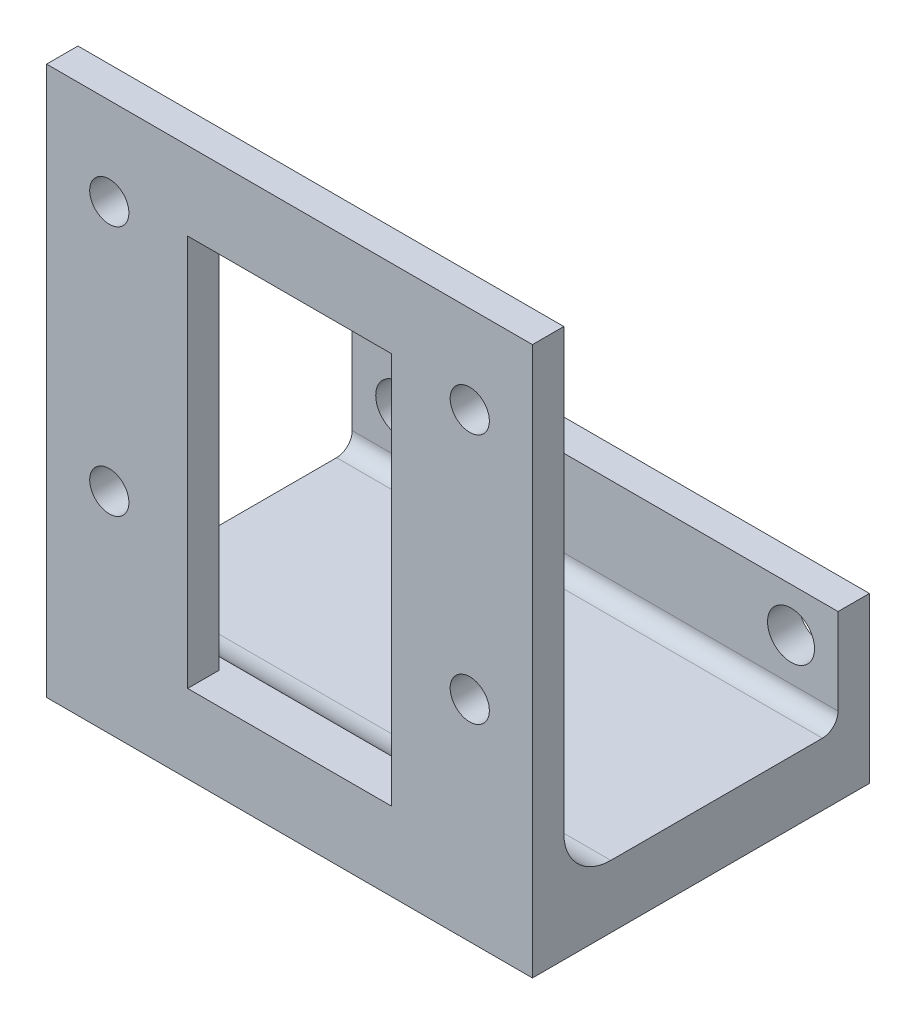
ISO-10303-21;
HEADER;
FILE_DESCRIPTION(('STEP AP214'),'2;1');
FILE_NAME('part.step','',(''),(''),'','','');
FILE_SCHEMA(('AUTOMOTIVE_DESIGN { 1 0 10303 214 1 1 1 1 }'));
ENDSEC;
DATA;
#1=APPLICATION_CONTEXT('core data for automotive mechanical design processes');
#2=APPLICATION_PROTOCOL_DEFINITION('international standard','automotive_design',2000,#1);
#3=PRODUCT_CONTEXT('',#1,'mechanical');
#4=PRODUCT('Part','Part','',(#3));
#5=PRODUCT_RELATED_PRODUCT_CATEGORY('part','',(#4));
#6=PRODUCT_DEFINITION_FORMATION('','',#4);
#7=PRODUCT_DEFINITION_CONTEXT('part definition',#1,'design');
#8=PRODUCT_DEFINITION('design','',#6,#7);
#9=PRODUCT_DEFINITION_SHAPE('','',#8);
#10=(LENGTH_UNIT() NAMED_UNIT(*) SI_UNIT(.MILLI.,.METRE.));
#11=(NAMED_UNIT(*) PLANE_ANGLE_UNIT() SI_UNIT($,.RADIAN.));
#12=(NAMED_UNIT(*) SI_UNIT($,.STERADIAN.) SOLID_ANGLE_UNIT());
#13=UNCERTAINTY_MEASURE_WITH_UNIT(LENGTH_MEASURE(1.E-05),#10,'distance_accuracy_value','');
#14=(GEOMETRIC_REPRESENTATION_CONTEXT(3) GLOBAL_UNCERTAINTY_ASSIGNED_CONTEXT((#13)) GLOBAL_UNIT_ASSIGNED_CONTEXT((#10,
#11,#12)) REPRESENTATION_CONTEXT('',''));
#15=CARTESIAN_POINT('',(0.,0.,0.));
#16=DIRECTION('',(0.,0.,1.));
#17=DIRECTION('',(1.,0.,0.));
#18=AXIS2_PLACEMENT_3D('',#15,#16,#17);
#19=CARTESIAN_POINT('',(0.,0.,25.));
#20=DIRECTION('',(0.,0.,-1.));
#21=DIRECTION('',(-1.,0.,0.));
#22=AXIS2_PLACEMENT_3D('',#19,#20,#21);
#23=PLANE('',#22);
#24=CARTESIAN_POINT('',(4.00000000000002,11.4,25.));
#25=DIRECTION('',(0.,0.,-1.));
#26=DIRECTION('',(-1.,0.,0.));
#27=AXIS2_PLACEMENT_3D('',#24,#25,#26);
#28=CIRCLE('',#27,1.25);
#29=CARTESIAN_POINT('',(2.75000000000001,11.4,25.));
#30=VERTEX_POINT('',#29);
#31=EDGE_CURVE('E323',#30,#30,#28,.T.);
#32=ORIENTED_EDGE('',*,*,#31,.F.);
#33=EDGE_LOOP('',(#32));
#34=FACE_BOUND('',#33,.T.);
#35=CARTESIAN_POINT('',(-19.,11.4,25.));
#36=DIRECTION('',(0.,0.,-1.));
#37=DIRECTION('',(-1.,0.,0.));
#38=AXIS2_PLACEMENT_3D('',#35,#36,#37);
#39=CIRCLE('',#38,1.25);
#40=CARTESIAN_POINT('',(-20.25,11.4,25.));
#41=VERTEX_POINT('',#40);
#42=EDGE_CURVE('E326',#41,#41,#39,.T.);
#43=ORIENTED_EDGE('',*,*,#42,.F.);
#44=EDGE_LOOP('',(#43));
#45=FACE_BOUND('',#44,.T.);
#46=CARTESIAN_POINT('',(-19.,27.4,25.));
#47=DIRECTION('',(0.,0.,-1.));
#48=DIRECTION('',(-1.,0.,0.));
#49=AXIS2_PLACEMENT_3D('',#46,#47,#48);
#50=CIRCLE('',#49,1.25);
#51=CARTESIAN_POINT('',(-20.25,27.4,25.));
#52=VERTEX_POINT('',#51);
#53=EDGE_CURVE('E329',#52,#52,#50,.T.);
#54=ORIENTED_EDGE('',*,*,#53,.F.);
#55=EDGE_LOOP('',(#54));
#56=FACE_BOUND('',#55,.T.);
#57=CARTESIAN_POINT('',(4.00000000000001,27.4,25.));
#58=DIRECTION('',(0.,0.,-1.));
#59=DIRECTION('',(-1.,0.,0.));
#60=AXIS2_PLACEMENT_3D('',#57,#58,#59);
#61=CIRCLE('',#60,1.25);
#62=CARTESIAN_POINT('',(2.75000000000001,27.4,25.));
#63=VERTEX_POINT('',#62);
#64=EDGE_CURVE('E317',#63,#63,#61,.T.);
#65=ORIENTED_EDGE('',*,*,#64,.F.);
#66=EDGE_LOOP('',(#65));
#67=FACE_BOUND('',#66,.T.);
#68=DIRECTION('',(1.,0.,0.));
#69=VECTOR('',#68,1.);
#70=CARTESIAN_POINT('',(0.,28.,25.));
#71=LINE('',#70,#69);
#72=CARTESIAN_POINT('',(-14.,28.,25.));
#73=VERTEX_POINT('',#72);
#74=CARTESIAN_POINT('',(-0.999999999999992,28.,25.));
#75=VERTEX_POINT('',#74);
#76=EDGE_CURVE('E237',#73,#75,#71,.T.);
#77=ORIENTED_EDGE('',*,*,#76,.F.);
#78=DIRECTION('',(0.,1.,0.));
#79=VECTOR('',#78,1.);
#80=CARTESIAN_POINT('',(-14.,0.,25.));
#81=LINE('',#80,#79);
#82=CARTESIAN_POINT('',(-14.,3.,25.));
#83=VERTEX_POINT('',#82);
#84=EDGE_CURVE('E302',#83,#73,#81,.T.);
#85=ORIENTED_EDGE('',*,*,#84,.F.);
#86=DIRECTION('',(-1.,0.,0.));
#87=VECTOR('',#86,1.);
#88=CARTESIAN_POINT('',(0.,3.,25.));
#89=LINE('',#88,#87);
#90=CARTESIAN_POINT('',(-16.,3.,25.));
#91=VERTEX_POINT('',#90);
#92=EDGE_CURVE('E306',#83,#91,#89,.T.);
#93=ORIENTED_EDGE('',*,*,#92,.T.);
#94=DIRECTION('',(0.,1.,0.));
#95=VECTOR('',#94,1.);
#96=CARTESIAN_POINT('',(-16.,0.,25.));
#97=LINE('',#96,#95);
#98=CARTESIAN_POINT('',(-16.,5.,25.));
#99=VERTEX_POINT('',#98);
#100=EDGE_CURVE('E183',#91,#99,#97,.T.);
#101=ORIENTED_EDGE('',*,*,#100,.T.);
#102=DIRECTION('',(-1.,0.,0.));
#103=VECTOR('',#102,1.);
#104=CARTESIAN_POINT('',(0.,5.,25.));
#105=LINE('',#104,#103);
#106=CARTESIAN_POINT('',(-23.,5.,25.));
#107=VERTEX_POINT('',#106);
#108=EDGE_CURVE('E221',#99,#107,#105,.T.);
#109=ORIENTED_EDGE('',*,*,#108,.T.);
#110=DIRECTION('',(0.,-1.,0.));
#111=VECTOR('',#110,1.);
#112=CARTESIAN_POINT('',(-23.,0.,25.));
#113=LINE('',#112,#111);
#114=CARTESIAN_POINT('',(-23.,33.,25.));
#115=VERTEX_POINT('',#114);
#116=EDGE_CURVE('E291',#115,#107,#113,.T.);
#117=ORIENTED_EDGE('',*,*,#116,.F.);
#118=DIRECTION('',(-1.,0.,0.));
#119=VECTOR('',#118,1.);
#120=CARTESIAN_POINT('',(-8.,33.,25.));
#121=LINE('',#120,#119);
#122=CARTESIAN_POINT('',(8.00000000000001,33.,25.));
#123=VERTEX_POINT('',#122);
#124=EDGE_CURVE('E200',#123,#115,#121,.T.);
#125=ORIENTED_EDGE('',*,*,#124,.F.);
#126=DIRECTION('',(0.,1.,0.));
#127=VECTOR('',#126,1.);
#128=CARTESIAN_POINT('',(8.00000000000001,-2.00000000000001,25.));
#129=LINE('',#128,#127);
#130=CARTESIAN_POINT('',(8.00000000000001,5.,25.));
#131=VERTEX_POINT('',#130);
#132=EDGE_CURVE('E198',#131,#123,#129,.T.);
#133=ORIENTED_EDGE('',*,*,#132,.F.);
#134=CARTESIAN_POINT('',(-0.999999999999989,5.,25.));
#135=VERTEX_POINT('',#134);
#136=EDGE_CURVE('E222',#131,#135,#105,.T.);
#137=ORIENTED_EDGE('',*,*,#136,.T.);
#138=DIRECTION('',(0.,1.,0.));
#139=VECTOR('',#138,1.);
#140=CARTESIAN_POINT('',(-0.999999999999988,0.,25.));
#141=LINE('',#140,#139);
#142=EDGE_CURVE('E271',#135,#75,#141,.T.);
#143=ORIENTED_EDGE('',*,*,#142,.T.);
#144=EDGE_LOOP('',(#77,#85,#93,#101,#109,#117,#125,#133,#137,#143));
#145=FACE_BOUND('',#144,.T.);
#146=ADVANCED_FACE('F60',(#34,#45,#56,#67,#145),#23,.T.);
#147=CARTESIAN_POINT('',(0.,5.,22.));
#148=DIRECTION('',(-1.,0.,0.));
#149=DIRECTION('',(0.,-1.,0.));
#150=AXIS2_PLACEMENT_3D('',#147,#148,#149);
#151=CYLINDRICAL_SURFACE('',#150,3.);
#152=DIRECTION('',(-1.,0.,0.));
#153=VECTOR('',#152,1.);
#154=CARTESIAN_POINT('',(8.00000000000001,2.,22.));
#155=LINE('',#154,#153);
#156=CARTESIAN_POINT('',(-23.,2.,22.));
#157=VERTEX_POINT('',#156);
#158=CARTESIAN_POINT('',(8.00000000000001,2.,22.));
#159=VERTEX_POINT('',#158);
#160=EDGE_CURVE('E225',#157,#159,#155,.F.);
#161=ORIENTED_EDGE('',*,*,#160,.F.);
#162=CARTESIAN_POINT('',(-23.,4.99999999999999,22.));
#163=DIRECTION('',(1.,0.,0.));
#164=DIRECTION('',(0.,1.,0.));
#165=AXIS2_PLACEMENT_3D('',#162,#163,#164);
#166=CIRCLE('',#165,3.);
#167=EDGE_CURVE('E293',#157,#107,#166,.F.);
#168=ORIENTED_EDGE('',*,*,#167,.T.);
#169=ORIENTED_EDGE('',*,*,#108,.F.);
#170=CARTESIAN_POINT('',(-16.,5.,22.));
#171=DIRECTION('',(-1.,0.,0.));
#172=DIRECTION('',(0.,-1.,0.));
#173=AXIS2_PLACEMENT_3D('',#170,#171,#172);
#174=CIRCLE('',#173,3.);
#175=CARTESIAN_POINT('',(-16.,3.,24.2360679774998));
#176=VERTEX_POINT('',#175);
#177=EDGE_CURVE('E229',#99,#176,#174,.F.);
#178=ORIENTED_EDGE('',*,*,#177,.T.);
#179=DIRECTION('',(-1.,0.,0.));
#180=VECTOR('',#179,1.);
#181=CARTESIAN_POINT('',(0.,3.,24.2360679774998));
#182=LINE('',#181,#180);
#183=CARTESIAN_POINT('',(-0.999999999999988,3.,24.2360679774998));
#184=VERTEX_POINT('',#183);
#185=EDGE_CURVE('E232',#184,#176,#182,.T.);
#186=ORIENTED_EDGE('',*,*,#185,.F.);
#187=CARTESIAN_POINT('',(-0.999999999999989,5.,22.));
#188=DIRECTION('',(-1.,0.,0.));
#189=DIRECTION('',(0.,-1.,0.));
#190=AXIS2_PLACEMENT_3D('',#187,#188,#189);
#191=CIRCLE('',#190,3.);
#192=EDGE_CURVE('E235',#135,#184,#191,.F.);
#193=ORIENTED_EDGE('',*,*,#192,.F.);
#194=ORIENTED_EDGE('',*,*,#136,.F.);
#195=CARTESIAN_POINT('',(8.00000000000001,5.,22.));
#196=DIRECTION('',(-1.,0.,0.));
#197=DIRECTION('',(0.,-1.,0.));
#198=AXIS2_PLACEMENT_3D('',#195,#196,#197);
#199=CIRCLE('',#198,3.);
#200=EDGE_CURVE('E227',#159,#131,#199,.T.);
#201=ORIENTED_EDGE('',*,*,#200,.F.);
#202=EDGE_LOOP('',(#161,#168,#169,#178,#186,#193,#194,#201));
#203=FACE_BOUND('',#202,.T.);
#204=ADVANCED_FACE('F373',(#203),#151,.F.);
#205=CARTESIAN_POINT('',(8.00000000000001,2.,25.));
#206=DIRECTION('',(0.,-1.,0.));
#207=DIRECTION('',(1.,0.,0.));
#208=AXIS2_PLACEMENT_3D('',#205,#206,#207);
#209=PLANE('',#208);
#210=DIRECTION('',(0.,0.,-1.));
#211=VECTOR('',#210,1.);
#212=CARTESIAN_POINT('',(8.00000000000001,2.,25.));
#213=LINE('',#212,#211);
#214=CARTESIAN_POINT('',(8.00000000000001,2.,8.5));
#215=VERTEX_POINT('',#214);
#216=EDGE_CURVE('E217',#159,#215,#213,.T.);
#217=ORIENTED_EDGE('',*,*,#216,.T.);
#218=DIRECTION('',(1.,0.,0.));
#219=VECTOR('',#218,1.);
#220=CARTESIAN_POINT('',(-23.,2.,8.5));
#221=LINE('',#220,#219);
#222=CARTESIAN_POINT('',(-23.,2.,8.5));
#223=VERTEX_POINT('',#222);
#224=EDGE_CURVE('E81',#215,#223,#221,.F.);
#225=ORIENTED_EDGE('',*,*,#224,.T.);
#226=DIRECTION('',(0.,0.,1.));
#227=VECTOR('',#226,1.);
#228=CARTESIAN_POINT('',(-23.,2.,25.));
#229=LINE('',#228,#227);
#230=EDGE_CURVE('E296',#223,#157,#229,.T.);
#231=ORIENTED_EDGE('',*,*,#230,.T.);
#232=ORIENTED_EDGE('',*,*,#160,.T.);
#233=EDGE_LOOP('',(#217,#225,#231,#232));
#234=FACE_BOUND('',#233,.T.);
#235=ADVANCED_FACE('F395',(#234),#209,.F.);
#236=CARTESIAN_POINT('',(8.00000000000001,-2.00000000000001,25.));
#237=DIRECTION('',(0.,1.,0.));
#238=DIRECTION('',(0.,0.,1.));
#239=AXIS2_PLACEMENT_3D('',#236,#237,#238);
#240=PLANE('',#239);
#241=DIRECTION('',(1.,0.,0.));
#242=VECTOR('',#241,1.);
#243=CARTESIAN_POINT('',(-7.99999999999999,-2.00000000000001,27.));
#244=LINE('',#243,#242);
#245=CARTESIAN_POINT('',(-23.,-2.00000000000001,27.));
#246=VERTEX_POINT('',#245);
#247=CARTESIAN_POINT('',(8.00000000000001,-2.00000000000001,27.));
#248=VERTEX_POINT('',#247);
#249=EDGE_CURVE('E191',#246,#248,#244,.T.);
#250=ORIENTED_EDGE('',*,*,#249,.F.);
#251=DIRECTION('',(0.,0.,-1.));
#252=VECTOR('',#251,1.);
#253=CARTESIAN_POINT('',(-23.,-2.00000000000001,32.5));
#254=LINE('',#253,#252);
#255=CARTESIAN_POINT('',(-23.,-2.00000000000001,5.5));
#256=VERTEX_POINT('',#255);
#257=EDGE_CURVE('E174',#246,#256,#254,.T.);
#258=ORIENTED_EDGE('',*,*,#257,.T.);
#259=DIRECTION('',(1.,0.,0.));
#260=VECTOR('',#259,1.);
#261=CARTESIAN_POINT('',(8.00000000000001,-2.00000000000001,5.5));
#262=LINE('',#261,#260);
#263=CARTESIAN_POINT('',(8.00000000000001,-2.00000000000001,5.5));
#264=VERTEX_POINT('',#263);
#265=EDGE_CURVE('E189',#256,#264,#262,.T.);
#266=ORIENTED_EDGE('',*,*,#265,.T.);
#267=DIRECTION('',(0.,0.,-1.));
#268=VECTOR('',#267,1.);
#269=CARTESIAN_POINT('',(8.00000000000001,-2.00000000000001,25.));
#270=LINE('',#269,#268);
#271=EDGE_CURVE('E219',#248,#264,#270,.T.);
#272=ORIENTED_EDGE('',*,*,#271,.F.);
#273=EDGE_LOOP('',(#250,#258,#266,#272));
#274=FACE_BOUND('',#273,.T.);
#275=ADVANCED_FACE('F187',(#274),#240,.F.);
#276=CARTESIAN_POINT('',(8.00000000000001,2.,25.));
#277=DIRECTION('',(-1.,0.,0.));
#278=DIRECTION('',(0.,-1.,0.));
#279=AXIS2_PLACEMENT_3D('',#276,#277,#278);
#280=PLANE('',#279);
#281=DIRECTION('',(0.,1.,0.));
#282=VECTOR('',#281,1.);
#283=CARTESIAN_POINT('',(8.00000000000001,-8.,5.5));
#284=LINE('',#283,#282);
#285=CARTESIAN_POINT('',(8.00000000000001,8.5,5.5));
#286=VERTEX_POINT('',#285);
#287=EDGE_CURVE('E196',#264,#286,#284,.T.);
#288=ORIENTED_EDGE('',*,*,#287,.T.);
#289=DIRECTION('',(0.,0.,-1.));
#290=VECTOR('',#289,1.);
#291=CARTESIAN_POINT('',(8.00000000000001,8.5,15.5));
#292=LINE('',#291,#290);
#293=CARTESIAN_POINT('',(8.00000000000001,8.5,7.5));
#294=VERTEX_POINT('',#293);
#295=EDGE_CURVE('E258',#294,#286,#292,.T.);
#296=ORIENTED_EDGE('',*,*,#295,.F.);
#297=DIRECTION('',(0.,-1.,0.));
#298=VECTOR('',#297,1.);
#299=CARTESIAN_POINT('',(8.00000000000001,10.,7.5));
#300=LINE('',#299,#298);
#301=CARTESIAN_POINT('',(8.00000000000001,3.,7.5));
#302=VERTEX_POINT('',#301);
#303=EDGE_CURVE('E202',#294,#302,#300,.T.);
#304=ORIENTED_EDGE('',*,*,#303,.T.);
#305=CARTESIAN_POINT('',(8.00000000000001,3.,8.5));
#306=DIRECTION('',(-1.,0.,0.));
#307=DIRECTION('',(0.,-1.,0.));
#308=AXIS2_PLACEMENT_3D('',#305,#306,#307);
#309=CIRCLE('',#308,1.);
#310=EDGE_CURVE('E68',#302,#215,#309,.T.);
#311=ORIENTED_EDGE('',*,*,#310,.T.);
#312=ORIENTED_EDGE('',*,*,#216,.F.);
#313=ORIENTED_EDGE('',*,*,#200,.T.);
#314=ORIENTED_EDGE('',*,*,#132,.T.);
#315=DIRECTION('',(0.,0.,-1.));
#316=VECTOR('',#315,1.);
#317=CARTESIAN_POINT('',(8.00000000000001,33.,27.));
#318=LINE('',#317,#316);
#319=CARTESIAN_POINT('',(8.00000000000001,33.,27.));
#320=VERTEX_POINT('',#319);
#321=EDGE_CURVE('E211',#320,#123,#318,.T.);
#322=ORIENTED_EDGE('',*,*,#321,.F.);
#323=DIRECTION('',(0.,1.,0.));
#324=VECTOR('',#323,1.);
#325=CARTESIAN_POINT('',(8.00000000000001,-2.00000000000001,27.));
#326=LINE('',#325,#324);
#327=EDGE_CURVE('E207',#248,#320,#326,.T.);
#328=ORIENTED_EDGE('',*,*,#327,.F.);
#329=ORIENTED_EDGE('',*,*,#271,.T.);
#330=EDGE_LOOP('',(#288,#296,#304,#311,#312,#313,#314,#322,#328,#329));
#331=FACE_BOUND('',#330,.T.);
#332=ADVANCED_FACE('F257',(#331),#280,.F.);
#333=CARTESIAN_POINT('',(-8.,33.,27.));
#334=DIRECTION('',(0.,-1.,0.));
#335=DIRECTION('',(0.,0.,-1.));
#336=AXIS2_PLACEMENT_3D('',#333,#334,#335);
#337=PLANE('',#336);
#338=ORIENTED_EDGE('',*,*,#124,.T.);
#339=DIRECTION('',(0.,0.,-1.));
#340=VECTOR('',#339,1.);
#341=CARTESIAN_POINT('',(-23.,33.,32.5));
#342=LINE('',#341,#340);
#343=CARTESIAN_POINT('',(-23.,33.,27.));
#344=VERTEX_POINT('',#343);
#345=EDGE_CURVE('E182',#344,#115,#342,.T.);
#346=ORIENTED_EDGE('',*,*,#345,.F.);
#347=DIRECTION('',(-1.,0.,0.));
#348=VECTOR('',#347,1.);
#349=CARTESIAN_POINT('',(-8.,33.,27.));
#350=LINE('',#349,#348);
#351=EDGE_CURVE('E209',#320,#344,#350,.T.);
#352=ORIENTED_EDGE('',*,*,#351,.F.);
#353=ORIENTED_EDGE('',*,*,#321,.T.);
#354=EDGE_LOOP('',(#338,#346,#352,#353));
#355=FACE_BOUND('',#354,.T.);
#356=ADVANCED_FACE('F347',(#355),#337,.F.);
#357=CARTESIAN_POINT('',(0.,0.,27.));
#358=DIRECTION('',(0.,0.,-1.));
#359=DIRECTION('',(-1.,0.,0.));
#360=AXIS2_PLACEMENT_3D('',#357,#358,#359);
#361=PLANE('',#360);
#362=CARTESIAN_POINT('',(4.00000000000002,11.4,27.));
#363=DIRECTION('',(0.,0.,1.));
#364=DIRECTION('',(1.,0.,0.));
#365=AXIS2_PLACEMENT_3D('',#362,#363,#364);
#366=CIRCLE('',#365,1.25);
#367=CARTESIAN_POINT('',(5.25000000000002,11.4,27.));
#368=VERTEX_POINT('',#367);
#369=EDGE_CURVE('E332',#368,#368,#366,.T.);
#370=ORIENTED_EDGE('',*,*,#369,.F.);
#371=EDGE_LOOP('',(#370));
#372=FACE_BOUND('',#371,.T.);
#373=CARTESIAN_POINT('',(-19.,11.4,27.));
#374=DIRECTION('',(0.,0.,1.));
#375=DIRECTION('',(1.,0.,0.));
#376=AXIS2_PLACEMENT_3D('',#373,#374,#375);
#377=CIRCLE('',#376,1.25);
#378=CARTESIAN_POINT('',(-17.75,11.4,27.));
#379=VERTEX_POINT('',#378);
#380=EDGE_CURVE('E336',#379,#379,#377,.T.);
#381=ORIENTED_EDGE('',*,*,#380,.F.);
#382=EDGE_LOOP('',(#381));
#383=FACE_BOUND('',#382,.T.);
#384=CARTESIAN_POINT('',(-19.,27.4,27.));
#385=DIRECTION('',(0.,0.,1.));
#386=DIRECTION('',(1.,0.,0.));
#387=AXIS2_PLACEMENT_3D('',#384,#385,#386);
#388=CIRCLE('',#387,1.25);
#389=CARTESIAN_POINT('',(-17.75,27.4,27.));
#390=VERTEX_POINT('',#389);
#391=EDGE_CURVE('E333',#390,#390,#388,.T.);
#392=ORIENTED_EDGE('',*,*,#391,.F.);
#393=EDGE_LOOP('',(#392));
#394=FACE_BOUND('',#393,.T.);
#395=CARTESIAN_POINT('',(4.00000000000001,27.4,27.));
#396=DIRECTION('',(0.,0.,1.));
#397=DIRECTION('',(1.,0.,0.));
#398=AXIS2_PLACEMENT_3D('',#395,#396,#397);
#399=CIRCLE('',#398,1.25);
#400=CARTESIAN_POINT('',(5.25000000000002,27.4,27.));
#401=VERTEX_POINT('',#400);
#402=EDGE_CURVE('E320',#401,#401,#399,.T.);
#403=ORIENTED_EDGE('',*,*,#402,.F.);
#404=EDGE_LOOP('',(#403));
#405=FACE_BOUND('',#404,.T.);
#406=DIRECTION('',(-1.,0.,0.));
#407=VECTOR('',#406,1.);
#408=CARTESIAN_POINT('',(0.,3.,27.));
#409=LINE('',#408,#407);
#410=CARTESIAN_POINT('',(-0.999999999999988,3.,27.));
#411=VERTEX_POINT('',#410);
#412=CARTESIAN_POINT('',(-14.,3.,27.));
#413=VERTEX_POINT('',#412);
#414=EDGE_CURVE('E284',#411,#413,#409,.T.);
#415=ORIENTED_EDGE('',*,*,#414,.T.);
#416=DIRECTION('',(0.,1.,0.));
#417=VECTOR('',#416,1.);
#418=CARTESIAN_POINT('',(-14.,0.,27.));
#419=LINE('',#418,#417);
#420=CARTESIAN_POINT('',(-14.,28.,27.));
#421=VERTEX_POINT('',#420);
#422=EDGE_CURVE('E305',#413,#421,#419,.T.);
#423=ORIENTED_EDGE('',*,*,#422,.T.);
#424=DIRECTION('',(-1.,0.,0.));
#425=VECTOR('',#424,1.);
#426=CARTESIAN_POINT('',(0.,28.,27.));
#427=LINE('',#426,#425);
#428=CARTESIAN_POINT('',(-0.999999999999992,28.,27.));
#429=VERTEX_POINT('',#428);
#430=EDGE_CURVE('E287',#429,#421,#427,.T.);
#431=ORIENTED_EDGE('',*,*,#430,.F.);
#432=DIRECTION('',(0.,-1.,0.));
#433=VECTOR('',#432,1.);
#434=CARTESIAN_POINT('',(-0.999999999999988,0.,27.));
#435=LINE('',#434,#433);
#436=EDGE_CURVE('E279',#429,#411,#435,.T.);
#437=ORIENTED_EDGE('',*,*,#436,.T.);
#438=EDGE_LOOP('',(#415,#423,#431,#437));
#439=FACE_BOUND('',#438,.T.);
#440=ORIENTED_EDGE('',*,*,#351,.T.);
#441=DIRECTION('',(0.,-1.,0.));
#442=VECTOR('',#441,1.);
#443=CARTESIAN_POINT('',(-23.,0.,27.));
#444=LINE('',#443,#442);
#445=EDGE_CURVE('E289',#344,#246,#444,.T.);
#446=ORIENTED_EDGE('',*,*,#445,.T.);
#447=ORIENTED_EDGE('',*,*,#249,.T.);
#448=ORIENTED_EDGE('',*,*,#327,.T.);
#449=EDGE_LOOP('',(#440,#446,#447,#448));
#450=FACE_BOUND('',#449,.T.);
#451=ADVANCED_FACE('F344',(#372,#383,#394,#405,#439,#450),#361,.F.);
#452=CARTESIAN_POINT('',(-7.99999999999999,-8.,5.5));
#453=DIRECTION('',(0.,0.,1.));
#454=DIRECTION('',(1.,0.,0.));
#455=AXIS2_PLACEMENT_3D('',#452,#453,#454);
#456=PLANE('',#455);
#457=CARTESIAN_POINT('',(-20.,5.69348198041553,5.5));
#458=DIRECTION('',(0.,0.,-1.));
#459=DIRECTION('',(-1.,0.,0.));
#460=AXIS2_PLACEMENT_3D('',#457,#458,#459);
#461=CIRCLE('',#460,1.5);
#462=CARTESIAN_POINT('',(-21.5,5.69348198041553,5.5));
#463=VERTEX_POINT('',#462);
#464=EDGE_CURVE('E245',#463,#463,#461,.T.);
#465=ORIENTED_EDGE('',*,*,#464,.F.);
#466=EDGE_LOOP('',(#465));
#467=FACE_BOUND('',#466,.T.);
#468=CARTESIAN_POINT('',(5.,5.69348198041553,5.5));
#469=DIRECTION('',(0.,0.,1.));
#470=DIRECTION('',(1.,0.,0.));
#471=AXIS2_PLACEMENT_3D('',#468,#469,#470);
#472=CIRCLE('',#471,1.5);
#473=CARTESIAN_POINT('',(6.5,5.69348198041553,5.5));
#474=VERTEX_POINT('',#473);
#475=EDGE_CURVE('E259',#474,#474,#472,.T.);
#476=ORIENTED_EDGE('',*,*,#475,.T.);
#477=EDGE_LOOP('',(#476));
#478=FACE_BOUND('',#477,.T.);
#479=ORIENTED_EDGE('',*,*,#265,.F.);
#480=DIRECTION('',(0.,-1.,0.));
#481=VECTOR('',#480,1.);
#482=CARTESIAN_POINT('',(-23.,33.,5.5));
#483=LINE('',#482,#481);
#484=CARTESIAN_POINT('',(-23.,8.5,5.5));
#485=VERTEX_POINT('',#484);
#486=EDGE_CURVE('E171',#485,#256,#483,.T.);
#487=ORIENTED_EDGE('',*,*,#486,.F.);
#488=DIRECTION('',(-1.,0.,0.));
#489=VECTOR('',#488,1.);
#490=CARTESIAN_POINT('',(8.00000000000001,8.5,5.5));
#491=LINE('',#490,#489);
#492=EDGE_CURVE('E269',#286,#485,#491,.T.);
#493=ORIENTED_EDGE('',*,*,#492,.F.);
#494=ORIENTED_EDGE('',*,*,#287,.F.);
#495=EDGE_LOOP('',(#479,#487,#493,#494));
#496=FACE_BOUND('',#495,.T.);
#497=ADVANCED_FACE('F194',(#467,#478,#496),#456,.F.);
#498=CARTESIAN_POINT('',(-7.99999999999999,10.,7.5));
#499=DIRECTION('',(0.,0.,-1.));
#500=DIRECTION('',(-1.,0.,0.));
#501=AXIS2_PLACEMENT_3D('',#498,#499,#500);
#502=PLANE('',#501);
#503=CARTESIAN_POINT('',(-20.,5.69348198041553,7.5));
#504=DIRECTION('',(0.,0.,-1.));
#505=DIRECTION('',(-1.,0.,0.));
#506=AXIS2_PLACEMENT_3D('',#503,#504,#505);
#507=CIRCLE('',#506,1.5);
#508=CARTESIAN_POINT('',(-21.5,5.69348198041553,7.5));
#509=VERTEX_POINT('',#508);
#510=EDGE_CURVE('E241',#509,#509,#507,.T.);
#511=ORIENTED_EDGE('',*,*,#510,.T.);
#512=EDGE_LOOP('',(#511));
#513=FACE_BOUND('',#512,.T.);
#514=CARTESIAN_POINT('',(5.,5.69348198041553,7.5));
#515=DIRECTION('',(0.,0.,1.));
#516=DIRECTION('',(1.,0.,0.));
#517=AXIS2_PLACEMENT_3D('',#514,#515,#516);
#518=CIRCLE('',#517,1.5);
#519=CARTESIAN_POINT('',(6.5,5.69348198041553,7.5));
#520=VERTEX_POINT('',#519);
#521=EDGE_CURVE('E261',#520,#520,#518,.T.);
#522=ORIENTED_EDGE('',*,*,#521,.F.);
#523=EDGE_LOOP('',(#522));
#524=FACE_BOUND('',#523,.T.);
#525=DIRECTION('',(0.,-1.,0.));
#526=VECTOR('',#525,1.);
#527=CARTESIAN_POINT('',(-23.,10.,7.5));
#528=LINE('',#527,#526);
#529=CARTESIAN_POINT('',(-23.,8.5,7.5));
#530=VERTEX_POINT('',#529);
#531=CARTESIAN_POINT('',(-23.,3.,7.5));
#532=VERTEX_POINT('',#531);
#533=EDGE_CURVE('E192',#530,#532,#528,.T.);
#534=ORIENTED_EDGE('',*,*,#533,.T.);
#535=DIRECTION('',(1.,0.,0.));
#536=VECTOR('',#535,1.);
#537=CARTESIAN_POINT('',(8.00000000000001,3.,7.5));
#538=LINE('',#537,#536);
#539=EDGE_CURVE('E240',#532,#302,#538,.T.);
#540=ORIENTED_EDGE('',*,*,#539,.T.);
#541=ORIENTED_EDGE('',*,*,#303,.F.);
#542=DIRECTION('',(-1.,0.,0.));
#543=VECTOR('',#542,1.);
#544=CARTESIAN_POINT('',(-7.99999999999999,8.5,7.5));
#545=LINE('',#544,#543);
#546=EDGE_CURVE('E266',#294,#530,#545,.T.);
#547=ORIENTED_EDGE('',*,*,#546,.T.);
#548=EDGE_LOOP('',(#534,#540,#541,#547));
#549=FACE_BOUND('',#548,.T.);
#550=ADVANCED_FACE('F252',(#513,#524,#549),#502,.F.);
#551=CARTESIAN_POINT('',(5.,5.69348198041553,-2.5));
#552=DIRECTION('',(0.,0.,1.));
#553=DIRECTION('',(1.,0.,0.));
#554=AXIS2_PLACEMENT_3D('',#551,#552,#553);
#555=CYLINDRICAL_SURFACE('',#554,1.5);
#556=ORIENTED_EDGE('',*,*,#521,.T.);
#557=EDGE_LOOP('',(#556));
#558=FACE_BOUND('',#557,.T.);
#559=ORIENTED_EDGE('',*,*,#475,.F.);
#560=EDGE_LOOP('',(#559));
#561=FACE_BOUND('',#560,.T.);
#562=ADVANCED_FACE('F444',(#558,#561),#555,.F.);
#563=CARTESIAN_POINT('',(8.00000000000001,8.5,15.5));
#564=DIRECTION('',(0.,-1.,0.));
#565=DIRECTION('',(0.,0.,-1.));
#566=AXIS2_PLACEMENT_3D('',#563,#564,#565);
#567=PLANE('',#566);
#568=ORIENTED_EDGE('',*,*,#492,.T.);
#569=DIRECTION('',(0.,0.,1.));
#570=VECTOR('',#569,1.);
#571=CARTESIAN_POINT('',(-23.,8.5,15.5));
#572=LINE('',#571,#570);
#573=EDGE_CURVE('E177',#485,#530,#572,.T.);
#574=ORIENTED_EDGE('',*,*,#573,.T.);
#575=ORIENTED_EDGE('',*,*,#546,.F.);
#576=ORIENTED_EDGE('',*,*,#295,.T.);
#577=EDGE_LOOP('',(#568,#574,#575,#576));
#578=FACE_BOUND('',#577,.T.);
#579=ADVANCED_FACE('F453',(#578),#567,.F.);
#580=CARTESIAN_POINT('',(0.,3.,17.));
#581=DIRECTION('',(0.,1.,0.));
#582=DIRECTION('',(-1.,0.,0.));
#583=AXIS2_PLACEMENT_3D('',#580,#581,#582);
#584=PLANE('',#583);
#585=ORIENTED_EDGE('',*,*,#92,.F.);
#586=DIRECTION('',(0.,0.,1.));
#587=VECTOR('',#586,1.);
#588=CARTESIAN_POINT('',(-14.,3.,-0.0798724079689069));
#589=LINE('',#588,#587);
#590=EDGE_CURVE('E303',#83,#413,#589,.T.);
#591=ORIENTED_EDGE('',*,*,#590,.T.);
#592=ORIENTED_EDGE('',*,*,#414,.F.);
#593=DIRECTION('',(0.,0.,1.));
#594=VECTOR('',#593,1.);
#595=CARTESIAN_POINT('',(-0.999999999999988,3.,17.));
#596=LINE('',#595,#594);
#597=EDGE_CURVE('E278',#184,#411,#596,.T.);
#598=ORIENTED_EDGE('',*,*,#597,.F.);
#599=ORIENTED_EDGE('',*,*,#185,.T.);
#600=DIRECTION('',(0.,0.,1.));
#601=VECTOR('',#600,1.);
#602=CARTESIAN_POINT('',(-16.,3.,17.));
#603=LINE('',#602,#601);
#604=EDGE_CURVE('E275',#176,#91,#603,.T.);
#605=ORIENTED_EDGE('',*,*,#604,.T.);
#606=EDGE_LOOP('',(#585,#591,#592,#598,#599,#605));
#607=FACE_BOUND('',#606,.T.);
#608=ADVANCED_FACE('F460',(#607),#584,.T.);
#609=CARTESIAN_POINT('',(0.,28.,17.));
#610=DIRECTION('',(0.,1.,0.));
#611=DIRECTION('',(-1.,0.,0.));
#612=AXIS2_PLACEMENT_3D('',#609,#610,#611);
#613=PLANE('',#612);
#614=ORIENTED_EDGE('',*,*,#430,.T.);
#615=DIRECTION('',(0.,0.,1.));
#616=VECTOR('',#615,1.);
#617=CARTESIAN_POINT('',(-14.,28.,-0.0798724079689069));
#618=LINE('',#617,#616);
#619=EDGE_CURVE('E244',#73,#421,#618,.T.);
#620=ORIENTED_EDGE('',*,*,#619,.F.);
#621=ORIENTED_EDGE('',*,*,#76,.T.);
#622=DIRECTION('',(0.,0.,1.));
#623=VECTOR('',#622,1.);
#624=CARTESIAN_POINT('',(-0.999999999999992,28.,17.));
#625=LINE('',#624,#623);
#626=EDGE_CURVE('E274',#75,#429,#625,.T.);
#627=ORIENTED_EDGE('',*,*,#626,.T.);
#628=EDGE_LOOP('',(#614,#620,#621,#627));
#629=FACE_BOUND('',#628,.T.);
#630=ADVANCED_FACE('F469',(#629),#613,.F.);
#631=CARTESIAN_POINT('',(-0.999999999999988,0.,17.));
#632=DIRECTION('',(-1.,0.,0.));
#633=DIRECTION('',(0.,-1.,0.));
#634=AXIS2_PLACEMENT_3D('',#631,#632,#633);
#635=PLANE('',#634);
#636=ORIENTED_EDGE('',*,*,#192,.T.);
#637=ORIENTED_EDGE('',*,*,#597,.T.);
#638=ORIENTED_EDGE('',*,*,#436,.F.);
#639=ORIENTED_EDGE('',*,*,#626,.F.);
#640=ORIENTED_EDGE('',*,*,#142,.F.);
#641=EDGE_LOOP('',(#636,#637,#638,#639,#640));
#642=FACE_BOUND('',#641,.T.);
#643=ADVANCED_FACE('F477',(#642),#635,.T.);
#644=CARTESIAN_POINT('',(-16.,0.,17.));
#645=DIRECTION('',(-1.,0.,0.));
#646=DIRECTION('',(0.,-1.,0.));
#647=AXIS2_PLACEMENT_3D('',#644,#645,#646);
#648=PLANE('',#647);
#649=ORIENTED_EDGE('',*,*,#177,.F.);
#650=ORIENTED_EDGE('',*,*,#100,.F.);
#651=ORIENTED_EDGE('',*,*,#604,.F.);
#652=EDGE_LOOP('',(#649,#650,#651));
#653=FACE_BOUND('',#652,.T.);
#654=ADVANCED_FACE('F485',(#653),#648,.F.);
#655=CARTESIAN_POINT('',(-23.,33.,32.5));
#656=DIRECTION('',(1.,0.,0.));
#657=DIRECTION('',(0.,1.,0.));
#658=AXIS2_PLACEMENT_3D('',#655,#656,#657);
#659=PLANE('',#658);
#660=ORIENTED_EDGE('',*,*,#345,.T.);
#661=ORIENTED_EDGE('',*,*,#116,.T.);
#662=ORIENTED_EDGE('',*,*,#167,.F.);
#663=ORIENTED_EDGE('',*,*,#230,.F.);
#664=CARTESIAN_POINT('',(-23.,3.,8.5));
#665=DIRECTION('',(1.,0.,0.));
#666=DIRECTION('',(0.,1.,0.));
#667=AXIS2_PLACEMENT_3D('',#664,#665,#666);
#668=CIRCLE('',#667,1.);
#669=EDGE_CURVE('E12',#223,#532,#668,.T.);
#670=ORIENTED_EDGE('',*,*,#669,.T.);
#671=ORIENTED_EDGE('',*,*,#533,.F.);
#672=ORIENTED_EDGE('',*,*,#573,.F.);
#673=ORIENTED_EDGE('',*,*,#486,.T.);
#674=ORIENTED_EDGE('',*,*,#257,.F.);
#675=ORIENTED_EDGE('',*,*,#445,.F.);
#676=EDGE_LOOP('',(#660,#661,#662,#663,#670,#671,#672,#673,#674,#675));
#677=FACE_BOUND('',#676,.T.);
#678=ADVANCED_FACE('F173',(#677),#659,.F.);
#679=CARTESIAN_POINT('',(-14.,0.,-0.0798724079689069));
#680=DIRECTION('',(1.,0.,0.));
#681=DIRECTION('',(0.,1.,0.));
#682=AXIS2_PLACEMENT_3D('',#679,#680,#681);
#683=PLANE('',#682);
#684=ORIENTED_EDGE('',*,*,#590,.F.);
#685=ORIENTED_EDGE('',*,*,#84,.T.);
#686=ORIENTED_EDGE('',*,*,#619,.T.);
#687=ORIENTED_EDGE('',*,*,#422,.F.);
#688=EDGE_LOOP('',(#684,#685,#686,#687));
#689=FACE_BOUND('',#688,.T.);
#690=ADVANCED_FACE('F386',(#689),#683,.T.);
#691=CARTESIAN_POINT('',(-20.,5.69348198041553,16.5));
#692=DIRECTION('',(0.,0.,-1.));
#693=DIRECTION('',(-1.,0.,0.));
#694=AXIS2_PLACEMENT_3D('',#691,#692,#693);
#695=CYLINDRICAL_SURFACE('',#694,1.5);
#696=ORIENTED_EDGE('',*,*,#464,.T.);
#697=EDGE_LOOP('',(#696));
#698=FACE_BOUND('',#697,.T.);
#699=ORIENTED_EDGE('',*,*,#510,.F.);
#700=EDGE_LOOP('',(#699));
#701=FACE_BOUND('',#700,.T.);
#702=ADVANCED_FACE('F378',(#698,#701),#695,.F.);
#703=CARTESIAN_POINT('',(-7.99999999999999,3.,8.5));
#704=DIRECTION('',(-1.,0.,0.));
#705=DIRECTION('',(0.,-1.,0.));
#706=AXIS2_PLACEMENT_3D('',#703,#704,#705);
#707=CYLINDRICAL_SURFACE('',#706,1.);
#708=ORIENTED_EDGE('',*,*,#669,.F.);
#709=ORIENTED_EDGE('',*,*,#224,.F.);
#710=ORIENTED_EDGE('',*,*,#310,.F.);
#711=ORIENTED_EDGE('',*,*,#539,.F.);
#712=EDGE_LOOP('',(#708,#709,#710,#711));
#713=FACE_BOUND('',#712,.T.);
#714=ADVANCED_FACE('F62',(#713),#707,.F.);
#715=CARTESIAN_POINT('',(4.00000000000001,27.4,17.));
#716=DIRECTION('',(0.,0.,1.));
#717=DIRECTION('',(1.,0.,0.));
#718=AXIS2_PLACEMENT_3D('',#715,#716,#717);
#719=CYLINDRICAL_SURFACE('',#718,1.25);
#720=ORIENTED_EDGE('',*,*,#64,.T.);
#721=EDGE_LOOP('',(#720));
#722=FACE_BOUND('',#721,.T.);
#723=ORIENTED_EDGE('',*,*,#402,.T.);
#724=EDGE_LOOP('',(#723));
#725=FACE_BOUND('',#724,.T.);
#726=ADVANCED_FACE('F377',(#722,#725),#719,.F.);
#727=CARTESIAN_POINT('',(-19.,27.4,17.));
#728=DIRECTION('',(0.,0.,1.));
#729=DIRECTION('',(1.,0.,0.));
#730=AXIS2_PLACEMENT_3D('',#727,#728,#729);
#731=CYLINDRICAL_SURFACE('',#730,1.25);
#732=ORIENTED_EDGE('',*,*,#53,.T.);
#733=EDGE_LOOP('',(#732));
#734=FACE_BOUND('',#733,.T.);
#735=ORIENTED_EDGE('',*,*,#391,.T.);
#736=EDGE_LOOP('',(#735));
#737=FACE_BOUND('',#736,.T.);
#738=ADVANCED_FACE('F383',(#734,#737),#731,.F.);
#739=CARTESIAN_POINT('',(-19.,11.4,17.));
#740=DIRECTION('',(0.,0.,1.));
#741=DIRECTION('',(1.,0.,0.));
#742=AXIS2_PLACEMENT_3D('',#739,#740,#741);
#743=CYLINDRICAL_SURFACE('',#742,1.25);
#744=ORIENTED_EDGE('',*,*,#42,.T.);
#745=EDGE_LOOP('',(#744));
#746=FACE_BOUND('',#745,.T.);
#747=ORIENTED_EDGE('',*,*,#380,.T.);
#748=EDGE_LOOP('',(#747));
#749=FACE_BOUND('',#748,.T.);
#750=ADVANCED_FACE('F614',(#746,#749),#743,.F.);
#751=CARTESIAN_POINT('',(4.00000000000002,11.4,17.));
#752=DIRECTION('',(0.,0.,1.));
#753=DIRECTION('',(1.,0.,0.));
#754=AXIS2_PLACEMENT_3D('',#751,#752,#753);
#755=CYLINDRICAL_SURFACE('',#754,1.25);
#756=ORIENTED_EDGE('',*,*,#31,.T.);
#757=EDGE_LOOP('',(#756));
#758=FACE_BOUND('',#757,.T.);
#759=ORIENTED_EDGE('',*,*,#369,.T.);
#760=EDGE_LOOP('',(#759));
#761=FACE_BOUND('',#760,.T.);
#762=ADVANCED_FACE('F342',(#758,#761),#755,.F.);
#763=CLOSED_SHELL('',(#146,#204,#235,#275,#332,#356,#451,#497,#550,#562,#579,#608,#630,#643,
#654,#678,#690,#702,#714,#726,#738,#750,#762));
#764=MANIFOLD_SOLID_BREP('B2',#763);
#765=ADVANCED_BREP_SHAPE_REPRESENTATION('',(#18,#764),#14);
#766=SHAPE_DEFINITION_REPRESENTATION(#9,#765);
ENDSEC;
END-ISO-10303-21;
